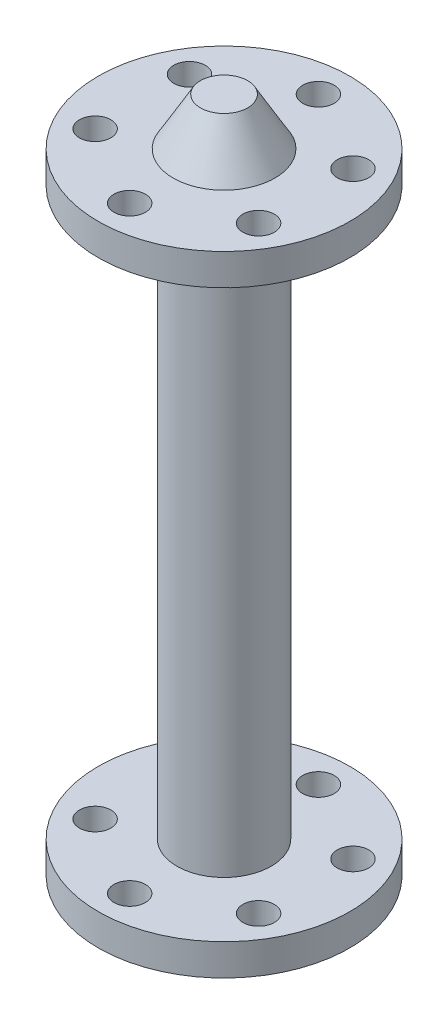
ISO-10303-21;
HEADER;
FILE_DESCRIPTION(('STEP AP214'),'2;1');
FILE_NAME('part.step','',(''),(''),'','','');
FILE_SCHEMA(('AUTOMOTIVE_DESIGN { 1 0 10303 214 1 1 1 1 }'));
ENDSEC;
DATA;
#1=APPLICATION_CONTEXT('core data for automotive mechanical design processes');
#2=APPLICATION_PROTOCOL_DEFINITION('international standard','automotive_design',2000,#1);
#3=PRODUCT_CONTEXT('',#1,'mechanical');
#4=PRODUCT('Part','Part','',(#3));
#5=PRODUCT_RELATED_PRODUCT_CATEGORY('part','',(#4));
#6=PRODUCT_DEFINITION_FORMATION('','',#4);
#7=PRODUCT_DEFINITION_CONTEXT('part definition',#1,'design');
#8=PRODUCT_DEFINITION('design','',#6,#7);
#9=PRODUCT_DEFINITION_SHAPE('','',#8);
#10=(LENGTH_UNIT() NAMED_UNIT(*) SI_UNIT(.MILLI.,.METRE.));
#11=(NAMED_UNIT(*) PLANE_ANGLE_UNIT() SI_UNIT($,.RADIAN.));
#12=(NAMED_UNIT(*) SI_UNIT($,.STERADIAN.) SOLID_ANGLE_UNIT());
#13=UNCERTAINTY_MEASURE_WITH_UNIT(LENGTH_MEASURE(1.E-05),#10,'distance_accuracy_value','');
#14=(GEOMETRIC_REPRESENTATION_CONTEXT(3) GLOBAL_UNCERTAINTY_ASSIGNED_CONTEXT((#13)) GLOBAL_UNIT_ASSIGNED_CONTEXT((#10,
#11,#12)) REPRESENTATION_CONTEXT('',''));
#15=CARTESIAN_POINT('',(0.,0.,0.));
#16=DIRECTION('',(0.,0.,1.));
#17=DIRECTION('',(1.,0.,0.));
#18=AXIS2_PLACEMENT_3D('',#15,#16,#17);
#19=CARTESIAN_POINT('',(0.,72.4729528523661,0.));
#20=DIRECTION('',(0.,-1.,0.));
#21=DIRECTION('',(1.,0.,0.));
#22=AXIS2_PLACEMENT_3D('',#19,#20,#21);
#23=PLANE('',#22);
#24=CARTESIAN_POINT('',(0.,72.4729528523661,0.));
#25=DIRECTION('',(0.,1.,0.));
#26=DIRECTION('',(-1.,0.,0.));
#27=AXIS2_PLACEMENT_3D('',#24,#25,#26);
#28=CIRCLE('',#27,15.);
#29=CARTESIAN_POINT('',(-15.,72.4729528523661,0.));
#30=VERTEX_POINT('',#29);
#31=EDGE_CURVE('E10',#30,#30,#28,.T.);
#32=ORIENTED_EDGE('',*,*,#31,.T.);
#33=EDGE_LOOP('',(#32));
#34=FACE_BOUND('',#33,.T.);
#35=ADVANCED_FACE('F43',(#34),#23,.F.);
#36=CARTESIAN_POINT('',(0.,42.4729528523661,0.));
#37=DIRECTION('',(0.,-1.,0.));
#38=DIRECTION('',(1.,0.,0.));
#39=AXIS2_PLACEMENT_3D('',#36,#37,#38);
#40=CONICAL_SURFACE('',#39,32.3205080756888,0.523598775598301);
#41=ORIENTED_EDGE('',*,*,#31,.F.);
#42=EDGE_LOOP('',(#41));
#43=FACE_BOUND('',#42,.T.);
#44=CARTESIAN_POINT('',(0.,42.4729528523661,0.));
#45=DIRECTION('',(0.,1.,0.));
#46=DIRECTION('',(-1.,0.,0.));
#47=AXIS2_PLACEMENT_3D('',#44,#45,#46);
#48=CIRCLE('',#47,32.3205080756888);
#49=CARTESIAN_POINT('',(-32.3205080756888,42.4729528523661,0.));
#50=VERTEX_POINT('',#49);
#51=EDGE_CURVE('E51',#50,#50,#48,.T.);
#52=ORIENTED_EDGE('',*,*,#51,.T.);
#53=EDGE_LOOP('',(#52));
#54=FACE_BOUND('',#53,.T.);
#55=ADVANCED_FACE('F239',(#43,#54),#40,.T.);
#56=CARTESIAN_POINT('',(32.3205080756888,42.4729528523661,0.));
#57=DIRECTION('',(0.,-1.,0.));
#58=DIRECTION('',(1.,0.,0.));
#59=AXIS2_PLACEMENT_3D('',#56,#57,#58);
#60=PLANE('',#59);
#61=CARTESIAN_POINT('',(51.961524227066,42.4729528523661,-30.0000000000006));
#62=DIRECTION('',(0.,1.,0.));
#63=DIRECTION('',(0.,0.,1.));
#64=AXIS2_PLACEMENT_3D('',#61,#62,#63);
#65=CIRCLE('',#64,9.99999999999995);
#66=CARTESIAN_POINT('',(51.961524227066,42.4729528523661,-20.0000000000007));
#67=VERTEX_POINT('',#66);
#68=EDGE_CURVE('E258',#67,#67,#65,.T.);
#69=ORIENTED_EDGE('',*,*,#68,.F.);
#70=EDGE_LOOP('',(#69));
#71=FACE_BOUND('',#70,.T.);
#72=CARTESIAN_POINT('',(51.9615242270666,42.4729528523661,29.9999999999995));
#73=DIRECTION('',(0.,1.,0.));
#74=DIRECTION('',(0.,0.,1.));
#75=AXIS2_PLACEMENT_3D('',#72,#73,#74);
#76=CIRCLE('',#75,9.99999999999995);
#77=CARTESIAN_POINT('',(51.9615242270666,42.4729528523661,39.9999999999995));
#78=VERTEX_POINT('',#77);
#79=EDGE_CURVE('E88',#78,#78,#76,.T.);
#80=ORIENTED_EDGE('',*,*,#79,.F.);
#81=EDGE_LOOP('',(#80));
#82=FACE_BOUND('',#81,.T.);
#83=CARTESIAN_POINT('',(0.,42.4729528523661,60.));
#84=DIRECTION('',(0.,1.,0.));
#85=DIRECTION('',(0.,0.,1.));
#86=AXIS2_PLACEMENT_3D('',#83,#84,#85);
#87=CIRCLE('',#86,9.99999999999995);
#88=CARTESIAN_POINT('',(0.,42.4729528523661,70.));
#89=VERTEX_POINT('',#88);
#90=EDGE_CURVE('E83',#89,#89,#87,.T.);
#91=ORIENTED_EDGE('',*,*,#90,.F.);
#92=EDGE_LOOP('',(#91));
#93=FACE_BOUND('',#92,.T.);
#94=CARTESIAN_POINT('',(-51.9615242270662,42.4729528523661,30.0000000000002));
#95=DIRECTION('',(0.,1.,0.));
#96=DIRECTION('',(0.,0.,1.));
#97=AXIS2_PLACEMENT_3D('',#94,#95,#96);
#98=CIRCLE('',#97,9.99999999999995);
#99=CARTESIAN_POINT('',(-51.9615242270662,42.4729528523661,40.0000000000002));
#100=VERTEX_POINT('',#99);
#101=EDGE_CURVE('E78',#100,#100,#98,.T.);
#102=ORIENTED_EDGE('',*,*,#101,.F.);
#103=EDGE_LOOP('',(#102));
#104=FACE_BOUND('',#103,.T.);
#105=CARTESIAN_POINT('',(-51.9615242270664,42.4729528523661,-29.9999999999999));
#106=DIRECTION('',(0.,1.,0.));
#107=DIRECTION('',(0.,0.,1.));
#108=AXIS2_PLACEMENT_3D('',#105,#106,#107);
#109=CIRCLE('',#108,9.99999999999995);
#110=CARTESIAN_POINT('',(-51.9615242270664,42.4729528523661,-19.9999999999999));
#111=VERTEX_POINT('',#110);
#112=EDGE_CURVE('E72',#111,#111,#109,.T.);
#113=ORIENTED_EDGE('',*,*,#112,.F.);
#114=EDGE_LOOP('',(#113));
#115=FACE_BOUND('',#114,.T.);
#116=CARTESIAN_POINT('',(0.,42.4729528523661,-60.));
#117=DIRECTION('',(0.,1.,0.));
#118=DIRECTION('',(0.,0.,1.));
#119=AXIS2_PLACEMENT_3D('',#116,#117,#118);
#120=CIRCLE('',#119,9.99999999999995);
#121=CARTESIAN_POINT('',(0.,42.4729528523661,-50.));
#122=VERTEX_POINT('',#121);
#123=EDGE_CURVE('E66',#122,#122,#120,.T.);
#124=ORIENTED_EDGE('',*,*,#123,.F.);
#125=EDGE_LOOP('',(#124));
#126=FACE_BOUND('',#125,.T.);
#127=ORIENTED_EDGE('',*,*,#51,.F.);
#128=EDGE_LOOP('',(#127));
#129=FACE_BOUND('',#128,.T.);
#130=CARTESIAN_POINT('',(0.,42.4729528523661,0.));
#131=DIRECTION('',(0.,1.,0.));
#132=DIRECTION('',(-1.,0.,0.));
#133=AXIS2_PLACEMENT_3D('',#130,#131,#132);
#134=CIRCLE('',#133,80.);
#135=CARTESIAN_POINT('',(-80.,42.4729528523661,0.));
#136=VERTEX_POINT('',#135);
#137=EDGE_CURVE('E57',#136,#136,#134,.T.);
#138=ORIENTED_EDGE('',*,*,#137,.T.);
#139=EDGE_LOOP('',(#138));
#140=FACE_BOUND('',#139,.T.);
#141=ADVANCED_FACE('F181',(#71,#82,#93,#104,#115,#126,#129,#140),#60,.F.);
#142=CARTESIAN_POINT('',(0.,72.4729528523661,0.));
#143=DIRECTION('',(0.,1.,0.));
#144=DIRECTION('',(-1.,0.,0.));
#145=AXIS2_PLACEMENT_3D('',#142,#143,#144);
#146=CYLINDRICAL_SURFACE('',#145,80.);
#147=ORIENTED_EDGE('',*,*,#137,.F.);
#148=EDGE_LOOP('',(#147));
#149=FACE_BOUND('',#148,.T.);
#150=CARTESIAN_POINT('',(0.,22.4729528523661,0.));
#151=DIRECTION('',(0.,1.,0.));
#152=DIRECTION('',(-1.,0.,0.));
#153=AXIS2_PLACEMENT_3D('',#150,#151,#152);
#154=CIRCLE('',#153,80.);
#155=CARTESIAN_POINT('',(-80.,22.4729528523661,0.));
#156=VERTEX_POINT('',#155);
#157=EDGE_CURVE('E174',#156,#156,#154,.T.);
#158=ORIENTED_EDGE('',*,*,#157,.T.);
#159=EDGE_LOOP('',(#158));
#160=FACE_BOUND('',#159,.T.);
#161=ADVANCED_FACE('F183',(#149,#160),#146,.T.);
#162=CARTESIAN_POINT('',(80.,22.4729528523661,0.));
#163=DIRECTION('',(0.,1.,0.));
#164=DIRECTION('',(-1.,0.,0.));
#165=AXIS2_PLACEMENT_3D('',#162,#163,#164);
#166=PLANE('',#165);
#167=CARTESIAN_POINT('',(51.961524227066,22.4729528523661,-30.0000000000006));
#168=DIRECTION('',(0.,1.,0.));
#169=DIRECTION('',(-1.,0.,0.));
#170=AXIS2_PLACEMENT_3D('',#167,#168,#169);
#171=CIRCLE('',#170,9.99999999999992);
#172=CARTESIAN_POINT('',(41.961524227066,22.4729528523661,-30.0000000000006));
#173=VERTEX_POINT('',#172);
#174=EDGE_CURVE('E103',#173,#173,#171,.T.);
#175=ORIENTED_EDGE('',*,*,#174,.T.);
#176=EDGE_LOOP('',(#175));
#177=FACE_BOUND('',#176,.T.);
#178=CARTESIAN_POINT('',(51.9615242270666,22.4729528523661,29.9999999999995));
#179=DIRECTION('',(0.,1.,0.));
#180=DIRECTION('',(-1.,0.,0.));
#181=AXIS2_PLACEMENT_3D('',#178,#179,#180);
#182=CIRCLE('',#181,9.99999999999992);
#183=CARTESIAN_POINT('',(41.9615242270667,22.4729528523661,29.9999999999995));
#184=VERTEX_POINT('',#183);
#185=EDGE_CURVE('E94',#184,#184,#182,.T.);
#186=ORIENTED_EDGE('',*,*,#185,.T.);
#187=EDGE_LOOP('',(#186));
#188=FACE_BOUND('',#187,.T.);
#189=CARTESIAN_POINT('',(0.,22.4729528523661,60.));
#190=DIRECTION('',(0.,1.,0.));
#191=DIRECTION('',(-1.,0.,0.));
#192=AXIS2_PLACEMENT_3D('',#189,#190,#191);
#193=CIRCLE('',#192,9.99999999999992);
#194=CARTESIAN_POINT('',(-9.99999999999992,22.4729528523661,60.));
#195=VERTEX_POINT('',#194);
#196=EDGE_CURVE('E116',#195,#195,#193,.T.);
#197=ORIENTED_EDGE('',*,*,#196,.T.);
#198=EDGE_LOOP('',(#197));
#199=FACE_BOUND('',#198,.T.);
#200=CARTESIAN_POINT('',(-51.9615242270662,22.4729528523661,30.0000000000002));
#201=DIRECTION('',(0.,1.,0.));
#202=DIRECTION('',(-1.,0.,0.));
#203=AXIS2_PLACEMENT_3D('',#200,#201,#202);
#204=CIRCLE('',#203,9.99999999999992);
#205=CARTESIAN_POINT('',(-61.9615242270661,22.4729528523661,30.0000000000002));
#206=VERTEX_POINT('',#205);
#207=EDGE_CURVE('E126',#206,#206,#204,.T.);
#208=ORIENTED_EDGE('',*,*,#207,.T.);
#209=EDGE_LOOP('',(#208));
#210=FACE_BOUND('',#209,.T.);
#211=CARTESIAN_POINT('',(-51.9615242270664,22.4729528523661,-29.9999999999999));
#212=DIRECTION('',(0.,1.,0.));
#213=DIRECTION('',(-1.,0.,0.));
#214=AXIS2_PLACEMENT_3D('',#211,#212,#213);
#215=CIRCLE('',#214,9.99999999999992);
#216=CARTESIAN_POINT('',(-61.9615242270663,22.4729528523661,-29.9999999999999));
#217=VERTEX_POINT('',#216);
#218=EDGE_CURVE('E136',#217,#217,#215,.T.);
#219=ORIENTED_EDGE('',*,*,#218,.T.);
#220=EDGE_LOOP('',(#219));
#221=FACE_BOUND('',#220,.T.);
#222=CARTESIAN_POINT('',(0.,22.4729528523661,-60.));
#223=DIRECTION('',(0.,1.,0.));
#224=DIRECTION('',(-1.,0.,0.));
#225=AXIS2_PLACEMENT_3D('',#222,#223,#224);
#226=CIRCLE('',#225,9.99999999999992);
#227=CARTESIAN_POINT('',(-9.99999999999992,22.4729528523661,-60.));
#228=VERTEX_POINT('',#227);
#229=EDGE_CURVE('E146',#228,#228,#226,.T.);
#230=ORIENTED_EDGE('',*,*,#229,.T.);
#231=EDGE_LOOP('',(#230));
#232=FACE_BOUND('',#231,.T.);
#233=ORIENTED_EDGE('',*,*,#157,.F.);
#234=EDGE_LOOP('',(#233));
#235=FACE_BOUND('',#234,.T.);
#236=CARTESIAN_POINT('',(0.,22.4729528523661,0.));
#237=DIRECTION('',(0.,1.,0.));
#238=DIRECTION('',(-1.,0.,0.));
#239=AXIS2_PLACEMENT_3D('',#236,#237,#238);
#240=CIRCLE('',#239,30.);
#241=CARTESIAN_POINT('',(-30.,22.4729528523661,0.));
#242=VERTEX_POINT('',#241);
#243=EDGE_CURVE('E170',#242,#242,#240,.T.);
#244=ORIENTED_EDGE('',*,*,#243,.T.);
#245=EDGE_LOOP('',(#244));
#246=FACE_BOUND('',#245,.T.);
#247=ADVANCED_FACE('F186',(#177,#188,#199,#210,#221,#232,#235,#246),#166,.F.);
#248=CARTESIAN_POINT('',(0.,72.4729528523661,0.));
#249=DIRECTION('',(0.,1.,0.));
#250=DIRECTION('',(-1.,0.,0.));
#251=AXIS2_PLACEMENT_3D('',#248,#249,#250);
#252=CYLINDRICAL_SURFACE('',#251,30.0000000000001);
#253=ORIENTED_EDGE('',*,*,#243,.F.);
#254=EDGE_LOOP('',(#253));
#255=FACE_BOUND('',#254,.T.);
#256=CARTESIAN_POINT('',(0.,-337.527047147634,0.));
#257=DIRECTION('',(0.,1.,0.));
#258=DIRECTION('',(-1.,0.,0.));
#259=AXIS2_PLACEMENT_3D('',#256,#257,#258);
#260=CIRCLE('',#259,30.0000000000001);
#261=CARTESIAN_POINT('',(-30.,-337.527047147634,0.));
#262=VERTEX_POINT('',#261);
#263=EDGE_CURVE('E166',#262,#262,#260,.T.);
#264=ORIENTED_EDGE('',*,*,#263,.T.);
#265=EDGE_LOOP('',(#264));
#266=FACE_BOUND('',#265,.T.);
#267=ADVANCED_FACE('F192',(#255,#266),#252,.T.);
#268=CARTESIAN_POINT('',(30.0000000000001,-337.527047147634,0.));
#269=DIRECTION('',(0.,-1.,0.));
#270=DIRECTION('',(1.,0.,0.));
#271=AXIS2_PLACEMENT_3D('',#268,#269,#270);
#272=PLANE('',#271);
#273=CARTESIAN_POINT('',(51.961524227066,-337.527047147634,-30.0000000000006));
#274=DIRECTION('',(0.,-1.,0.));
#275=DIRECTION('',(1.,0.,0.));
#276=AXIS2_PLACEMENT_3D('',#273,#274,#275);
#277=CIRCLE('',#276,9.99999999999992);
#278=CARTESIAN_POINT('',(61.9615242270659,-337.527047147634,-30.0000000000006));
#279=VERTEX_POINT('',#278);
#280=EDGE_CURVE('E97',#279,#279,#277,.T.);
#281=ORIENTED_EDGE('',*,*,#280,.T.);
#282=EDGE_LOOP('',(#281));
#283=FACE_BOUND('',#282,.T.);
#284=CARTESIAN_POINT('',(51.9615242270666,-337.527047147634,29.9999999999995));
#285=DIRECTION('',(0.,-1.,0.));
#286=DIRECTION('',(1.,0.,0.));
#287=AXIS2_PLACEMENT_3D('',#284,#285,#286);
#288=CIRCLE('',#287,9.99999999999992);
#289=CARTESIAN_POINT('',(61.9615242270665,-337.527047147634,29.9999999999995));
#290=VERTEX_POINT('',#289);
#291=EDGE_CURVE('E87',#290,#290,#288,.T.);
#292=ORIENTED_EDGE('',*,*,#291,.T.);
#293=EDGE_LOOP('',(#292));
#294=FACE_BOUND('',#293,.T.);
#295=CARTESIAN_POINT('',(0.,-337.527047147634,60.));
#296=DIRECTION('',(0.,-1.,0.));
#297=DIRECTION('',(1.,0.,0.));
#298=AXIS2_PLACEMENT_3D('',#295,#296,#297);
#299=CIRCLE('',#298,9.99999999999992);
#300=CARTESIAN_POINT('',(9.99999999999992,-337.527047147634,60.));
#301=VERTEX_POINT('',#300);
#302=EDGE_CURVE('E82',#301,#301,#299,.T.);
#303=ORIENTED_EDGE('',*,*,#302,.T.);
#304=EDGE_LOOP('',(#303));
#305=FACE_BOUND('',#304,.T.);
#306=CARTESIAN_POINT('',(-51.9615242270662,-337.527047147634,30.0000000000002));
#307=DIRECTION('',(0.,-1.,0.));
#308=DIRECTION('',(1.,0.,0.));
#309=AXIS2_PLACEMENT_3D('',#306,#307,#308);
#310=CIRCLE('',#309,9.99999999999992);
#311=CARTESIAN_POINT('',(-41.9615242270663,-337.527047147634,30.0000000000002));
#312=VERTEX_POINT('',#311);
#313=EDGE_CURVE('E77',#312,#312,#310,.T.);
#314=ORIENTED_EDGE('',*,*,#313,.T.);
#315=EDGE_LOOP('',(#314));
#316=FACE_BOUND('',#315,.T.);
#317=CARTESIAN_POINT('',(-51.9615242270664,-337.527047147634,-29.9999999999999));
#318=DIRECTION('',(0.,-1.,0.));
#319=DIRECTION('',(1.,0.,0.));
#320=AXIS2_PLACEMENT_3D('',#317,#318,#319);
#321=CIRCLE('',#320,9.99999999999992);
#322=CARTESIAN_POINT('',(-41.9615242270665,-337.527047147634,-29.9999999999999));
#323=VERTEX_POINT('',#322);
#324=EDGE_CURVE('E71',#323,#323,#321,.T.);
#325=ORIENTED_EDGE('',*,*,#324,.T.);
#326=EDGE_LOOP('',(#325));
#327=FACE_BOUND('',#326,.T.);
#328=CARTESIAN_POINT('',(0.,-337.527047147634,-60.));
#329=DIRECTION('',(0.,-1.,0.));
#330=DIRECTION('',(1.,0.,0.));
#331=AXIS2_PLACEMENT_3D('',#328,#329,#330);
#332=CIRCLE('',#331,9.99999999999992);
#333=CARTESIAN_POINT('',(9.99999999999992,-337.527047147634,-60.));
#334=VERTEX_POINT('',#333);
#335=EDGE_CURVE('E65',#334,#334,#332,.T.);
#336=ORIENTED_EDGE('',*,*,#335,.T.);
#337=EDGE_LOOP('',(#336));
#338=FACE_BOUND('',#337,.T.);
#339=ORIENTED_EDGE('',*,*,#263,.F.);
#340=EDGE_LOOP('',(#339));
#341=FACE_BOUND('',#340,.T.);
#342=CARTESIAN_POINT('',(0.,-337.527047147634,0.));
#343=DIRECTION('',(0.,1.,0.));
#344=DIRECTION('',(-1.,0.,0.));
#345=AXIS2_PLACEMENT_3D('',#342,#343,#344);
#346=CIRCLE('',#345,80.);
#347=CARTESIAN_POINT('',(-80.,-337.527047147634,0.));
#348=VERTEX_POINT('',#347);
#349=EDGE_CURVE('E162',#348,#348,#346,.T.);
#350=ORIENTED_EDGE('',*,*,#349,.T.);
#351=EDGE_LOOP('',(#350));
#352=FACE_BOUND('',#351,.T.);
#353=ADVANCED_FACE('F199',(#283,#294,#305,#316,#327,#338,#341,#352),#272,.F.);
#354=CARTESIAN_POINT('',(0.,72.4729528523661,0.));
#355=DIRECTION('',(0.,1.,0.));
#356=DIRECTION('',(-1.,0.,0.));
#357=AXIS2_PLACEMENT_3D('',#354,#355,#356);
#358=CYLINDRICAL_SURFACE('',#357,80.);
#359=ORIENTED_EDGE('',*,*,#349,.F.);
#360=EDGE_LOOP('',(#359));
#361=FACE_BOUND('',#360,.T.);
#362=CARTESIAN_POINT('',(0.,-357.527047147634,0.));
#363=DIRECTION('',(0.,1.,0.));
#364=DIRECTION('',(-1.,0.,0.));
#365=AXIS2_PLACEMENT_3D('',#362,#363,#364);
#366=CIRCLE('',#365,80.);
#367=CARTESIAN_POINT('',(-80.,-357.527047147634,0.));
#368=VERTEX_POINT('',#367);
#369=EDGE_CURVE('E158',#368,#368,#366,.T.);
#370=ORIENTED_EDGE('',*,*,#369,.T.);
#371=EDGE_LOOP('',(#370));
#372=FACE_BOUND('',#371,.T.);
#373=ADVANCED_FACE('F205',(#361,#372),#358,.T.);
#374=CARTESIAN_POINT('',(80.0000000000001,-357.527047147634,0.));
#375=DIRECTION('',(0.,1.,0.));
#376=DIRECTION('',(-1.,0.,0.));
#377=AXIS2_PLACEMENT_3D('',#374,#375,#376);
#378=PLANE('',#377);
#379=CARTESIAN_POINT('',(51.961524227066,-357.527047147634,-30.0000000000006));
#380=DIRECTION('',(0.,1.,0.));
#381=DIRECTION('',(-1.,0.,0.));
#382=AXIS2_PLACEMENT_3D('',#379,#380,#381);
#383=CIRCLE('',#382,9.99999999999992);
#384=CARTESIAN_POINT('',(41.961524227066,-357.527047147634,-30.0000000000006));
#385=VERTEX_POINT('',#384);
#386=EDGE_CURVE('E46',#385,#385,#383,.T.);
#387=ORIENTED_EDGE('',*,*,#386,.T.);
#388=EDGE_LOOP('',(#387));
#389=FACE_BOUND('',#388,.T.);
#390=CARTESIAN_POINT('',(51.9615242270666,-357.527047147634,29.9999999999995));
#391=DIRECTION('',(0.,1.,0.));
#392=DIRECTION('',(-1.,0.,0.));
#393=AXIS2_PLACEMENT_3D('',#390,#391,#392);
#394=CIRCLE('',#393,9.99999999999992);
#395=CARTESIAN_POINT('',(41.9615242270667,-357.527047147634,29.9999999999995));
#396=VERTEX_POINT('',#395);
#397=EDGE_CURVE('E84',#396,#396,#394,.T.);
#398=ORIENTED_EDGE('',*,*,#397,.T.);
#399=EDGE_LOOP('',(#398));
#400=FACE_BOUND('',#399,.T.);
#401=CARTESIAN_POINT('',(0.,-357.527047147634,60.));
#402=DIRECTION('',(0.,1.,0.));
#403=DIRECTION('',(-1.,0.,0.));
#404=AXIS2_PLACEMENT_3D('',#401,#402,#403);
#405=CIRCLE('',#404,9.99999999999992);
#406=CARTESIAN_POINT('',(-9.99999999999992,-357.527047147634,60.));
#407=VERTEX_POINT('',#406);
#408=EDGE_CURVE('E79',#407,#407,#405,.T.);
#409=ORIENTED_EDGE('',*,*,#408,.T.);
#410=EDGE_LOOP('',(#409));
#411=FACE_BOUND('',#410,.T.);
#412=CARTESIAN_POINT('',(-51.9615242270662,-357.527047147634,30.0000000000002));
#413=DIRECTION('',(0.,1.,0.));
#414=DIRECTION('',(-1.,0.,0.));
#415=AXIS2_PLACEMENT_3D('',#412,#413,#414);
#416=CIRCLE('',#415,9.99999999999992);
#417=CARTESIAN_POINT('',(-61.9615242270661,-357.527047147634,30.0000000000002));
#418=VERTEX_POINT('',#417);
#419=EDGE_CURVE('E73',#418,#418,#416,.T.);
#420=ORIENTED_EDGE('',*,*,#419,.T.);
#421=EDGE_LOOP('',(#420));
#422=FACE_BOUND('',#421,.T.);
#423=CARTESIAN_POINT('',(-51.9615242270664,-357.527047147634,-29.9999999999999));
#424=DIRECTION('',(0.,1.,0.));
#425=DIRECTION('',(-1.,0.,0.));
#426=AXIS2_PLACEMENT_3D('',#423,#424,#425);
#427=CIRCLE('',#426,9.99999999999992);
#428=CARTESIAN_POINT('',(-61.9615242270663,-357.527047147634,-29.9999999999999));
#429=VERTEX_POINT('',#428);
#430=EDGE_CURVE('E67',#429,#429,#427,.T.);
#431=ORIENTED_EDGE('',*,*,#430,.T.);
#432=EDGE_LOOP('',(#431));
#433=FACE_BOUND('',#432,.T.);
#434=CARTESIAN_POINT('',(0.,-357.527047147634,-60.));
#435=DIRECTION('',(0.,1.,0.));
#436=DIRECTION('',(-1.,0.,0.));
#437=AXIS2_PLACEMENT_3D('',#434,#435,#436);
#438=CIRCLE('',#437,9.99999999999992);
#439=CARTESIAN_POINT('',(-9.99999999999992,-357.527047147634,-60.));
#440=VERTEX_POINT('',#439);
#441=EDGE_CURVE('E61',#440,#440,#438,.T.);
#442=ORIENTED_EDGE('',*,*,#441,.T.);
#443=EDGE_LOOP('',(#442));
#444=FACE_BOUND('',#443,.T.);
#445=ORIENTED_EDGE('',*,*,#369,.F.);
#446=EDGE_LOOP('',(#445));
#447=FACE_BOUND('',#446,.T.);
#448=CARTESIAN_POINT('',(0.,-357.527047147634,0.));
#449=DIRECTION('',(0.,1.,0.));
#450=DIRECTION('',(-1.,0.,0.));
#451=AXIS2_PLACEMENT_3D('',#448,#449,#450);
#452=CIRCLE('',#451,32.3205080756886);
#453=CARTESIAN_POINT('',(-32.3205080756885,-357.527047147634,0.));
#454=VERTEX_POINT('',#453);
#455=EDGE_CURVE('E154',#454,#454,#452,.T.);
#456=ORIENTED_EDGE('',*,*,#455,.T.);
#457=EDGE_LOOP('',(#456));
#458=FACE_BOUND('',#457,.T.);
#459=ADVANCED_FACE('F212',(#389,#400,#411,#422,#433,#444,#447,#458),#378,.F.);
#460=CARTESIAN_POINT('',(0.,-387.527047147634,0.));
#461=DIRECTION('',(0.,1.,0.));
#462=DIRECTION('',(-1.,0.,0.));
#463=AXIS2_PLACEMENT_3D('',#460,#461,#462);
#464=CONICAL_SURFACE('',#463,15.,0.523598775598293);
#465=ORIENTED_EDGE('',*,*,#455,.F.);
#466=EDGE_LOOP('',(#465));
#467=FACE_BOUND('',#466,.T.);
#468=CARTESIAN_POINT('',(0.,-387.527047147634,0.));
#469=DIRECTION('',(0.,1.,0.));
#470=DIRECTION('',(-1.,0.,0.));
#471=AXIS2_PLACEMENT_3D('',#468,#469,#470);
#472=CIRCLE('',#471,15.);
#473=CARTESIAN_POINT('',(-15.,-387.527047147634,0.));
#474=VERTEX_POINT('',#473);
#475=EDGE_CURVE('E150',#474,#474,#472,.T.);
#476=ORIENTED_EDGE('',*,*,#475,.T.);
#477=EDGE_LOOP('',(#476));
#478=FACE_BOUND('',#477,.T.);
#479=ADVANCED_FACE('F218',(#467,#478),#464,.T.);
#480=CARTESIAN_POINT('',(15.0000000000001,-387.527047147634,0.));
#481=DIRECTION('',(0.,1.,0.));
#482=DIRECTION('',(-1.,0.,0.));
#483=AXIS2_PLACEMENT_3D('',#480,#481,#482);
#484=PLANE('',#483);
#485=ORIENTED_EDGE('',*,*,#475,.F.);
#486=EDGE_LOOP('',(#485));
#487=FACE_BOUND('',#486,.T.);
#488=ADVANCED_FACE('F225',(#487),#484,.F.);
#489=CARTESIAN_POINT('',(0.,42.4729528523661,-60.));
#490=DIRECTION('',(0.,1.,0.));
#491=DIRECTION('',(0.,0.,1.));
#492=AXIS2_PLACEMENT_3D('',#489,#490,#491);
#493=CYLINDRICAL_SURFACE('',#492,9.99999999999992);
#494=ORIENTED_EDGE('',*,*,#441,.F.);
#495=EDGE_LOOP('',(#494));
#496=FACE_BOUND('',#495,.T.);
#497=ORIENTED_EDGE('',*,*,#335,.F.);
#498=EDGE_LOOP('',(#497));
#499=FACE_BOUND('',#498,.T.);
#500=ADVANCED_FACE('F230',(#496,#499),#493,.F.);
#501=ORIENTED_EDGE('',*,*,#123,.T.);
#502=EDGE_LOOP('',(#501));
#503=FACE_BOUND('',#502,.T.);
#504=ORIENTED_EDGE('',*,*,#229,.F.);
#505=EDGE_LOOP('',(#504));
#506=FACE_BOUND('',#505,.T.);
#507=ADVANCED_FACE('F235',(#503,#506),#493,.F.);
#508=CARTESIAN_POINT('',(-51.9615242270664,42.4729528523661,-29.9999999999999));
#509=DIRECTION('',(0.,1.,0.));
#510=DIRECTION('',(0.,0.,1.));
#511=AXIS2_PLACEMENT_3D('',#508,#509,#510);
#512=CYLINDRICAL_SURFACE('',#511,9.99999999999992);
#513=ORIENTED_EDGE('',*,*,#430,.F.);
#514=EDGE_LOOP('',(#513));
#515=FACE_BOUND('',#514,.T.);
#516=ORIENTED_EDGE('',*,*,#324,.F.);
#517=EDGE_LOOP('',(#516));
#518=FACE_BOUND('',#517,.T.);
#519=ADVANCED_FACE('F269',(#515,#518),#512,.F.);
#520=ORIENTED_EDGE('',*,*,#112,.T.);
#521=EDGE_LOOP('',(#520));
#522=FACE_BOUND('',#521,.T.);
#523=ORIENTED_EDGE('',*,*,#218,.F.);
#524=EDGE_LOOP('',(#523));
#525=FACE_BOUND('',#524,.T.);
#526=ADVANCED_FACE('F275',(#522,#525),#512,.F.);
#527=CARTESIAN_POINT('',(-51.9615242270662,42.4729528523661,30.0000000000002));
#528=DIRECTION('',(0.,1.,0.));
#529=DIRECTION('',(0.,0.,1.));
#530=AXIS2_PLACEMENT_3D('',#527,#528,#529);
#531=CYLINDRICAL_SURFACE('',#530,9.99999999999992);
#532=ORIENTED_EDGE('',*,*,#419,.F.);
#533=EDGE_LOOP('',(#532));
#534=FACE_BOUND('',#533,.T.);
#535=ORIENTED_EDGE('',*,*,#313,.F.);
#536=EDGE_LOOP('',(#535));
#537=FACE_BOUND('',#536,.T.);
#538=ADVANCED_FACE('F280',(#534,#537),#531,.F.);
#539=ORIENTED_EDGE('',*,*,#101,.T.);
#540=EDGE_LOOP('',(#539));
#541=FACE_BOUND('',#540,.T.);
#542=ORIENTED_EDGE('',*,*,#207,.F.);
#543=EDGE_LOOP('',(#542));
#544=FACE_BOUND('',#543,.T.);
#545=ADVANCED_FACE('F282',(#541,#544),#531,.F.);
#546=CARTESIAN_POINT('',(0.,42.4729528523661,60.));
#547=DIRECTION('',(0.,1.,0.));
#548=DIRECTION('',(0.,0.,1.));
#549=AXIS2_PLACEMENT_3D('',#546,#547,#548);
#550=CYLINDRICAL_SURFACE('',#549,9.99999999999992);
#551=ORIENTED_EDGE('',*,*,#408,.F.);
#552=EDGE_LOOP('',(#551));
#553=FACE_BOUND('',#552,.T.);
#554=ORIENTED_EDGE('',*,*,#302,.F.);
#555=EDGE_LOOP('',(#554));
#556=FACE_BOUND('',#555,.T.);
#557=ADVANCED_FACE('F285',(#553,#556),#550,.F.);
#558=ORIENTED_EDGE('',*,*,#90,.T.);
#559=EDGE_LOOP('',(#558));
#560=FACE_BOUND('',#559,.T.);
#561=ORIENTED_EDGE('',*,*,#196,.F.);
#562=EDGE_LOOP('',(#561));
#563=FACE_BOUND('',#562,.T.);
#564=ADVANCED_FACE('F287',(#560,#563),#550,.F.);
#565=CARTESIAN_POINT('',(51.9615242270666,42.4729528523661,29.9999999999995));
#566=DIRECTION('',(0.,1.,0.));
#567=DIRECTION('',(0.,0.,1.));
#568=AXIS2_PLACEMENT_3D('',#565,#566,#567);
#569=CYLINDRICAL_SURFACE('',#568,9.99999999999992);
#570=ORIENTED_EDGE('',*,*,#397,.F.);
#571=EDGE_LOOP('',(#570));
#572=FACE_BOUND('',#571,.T.);
#573=ORIENTED_EDGE('',*,*,#291,.F.);
#574=EDGE_LOOP('',(#573));
#575=FACE_BOUND('',#574,.T.);
#576=ADVANCED_FACE('F290',(#572,#575),#569,.F.);
#577=ORIENTED_EDGE('',*,*,#79,.T.);
#578=EDGE_LOOP('',(#577));
#579=FACE_BOUND('',#578,.T.);
#580=ORIENTED_EDGE('',*,*,#185,.F.);
#581=EDGE_LOOP('',(#580));
#582=FACE_BOUND('',#581,.T.);
#583=ADVANCED_FACE('F292',(#579,#582),#569,.F.);
#584=CARTESIAN_POINT('',(51.961524227066,42.4729528523661,-30.0000000000006));
#585=DIRECTION('',(0.,1.,0.));
#586=DIRECTION('',(0.,0.,1.));
#587=AXIS2_PLACEMENT_3D('',#584,#585,#586);
#588=CYLINDRICAL_SURFACE('',#587,9.99999999999992);
#589=ORIENTED_EDGE('',*,*,#386,.F.);
#590=EDGE_LOOP('',(#589));
#591=FACE_BOUND('',#590,.T.);
#592=ORIENTED_EDGE('',*,*,#280,.F.);
#593=EDGE_LOOP('',(#592));
#594=FACE_BOUND('',#593,.T.);
#595=ADVANCED_FACE('F295',(#591,#594),#588,.F.);
#596=ORIENTED_EDGE('',*,*,#68,.T.);
#597=EDGE_LOOP('',(#596));
#598=FACE_BOUND('',#597,.T.);
#599=ORIENTED_EDGE('',*,*,#174,.F.);
#600=EDGE_LOOP('',(#599));
#601=FACE_BOUND('',#600,.T.);
#602=ADVANCED_FACE('F297',(#598,#601),#588,.F.);
#603=CLOSED_SHELL('',(#35,#55,#141,#161,#247,#267,#353,#373,#459,#479,#488,#500,#507,#519,#526,
#538,#545,#557,#564,#576,#583,#595,#602));
#604=MANIFOLD_SOLID_BREP('B2',#603);
#605=ADVANCED_BREP_SHAPE_REPRESENTATION('',(#18,#604),#14);
#606=SHAPE_DEFINITION_REPRESENTATION(#9,#605);
ENDSEC;
END-ISO-10303-21;
